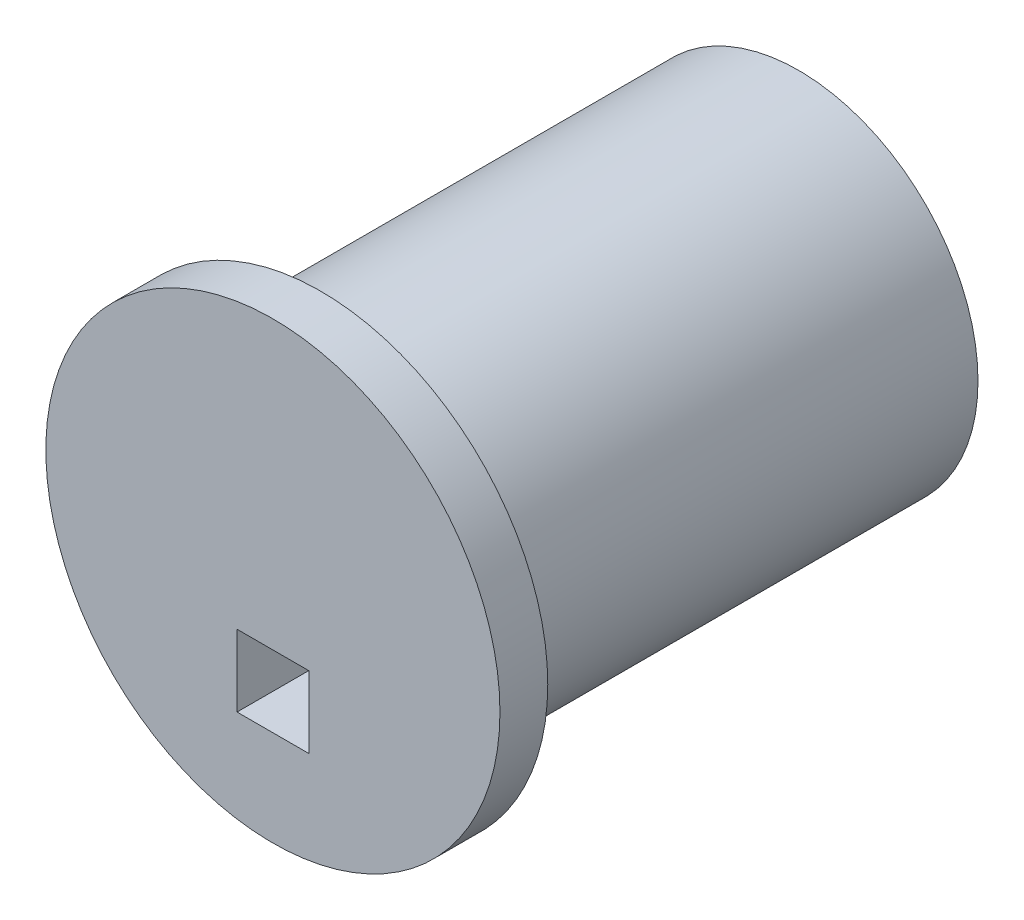
ISO-10303-21;
HEADER;
FILE_DESCRIPTION(('STEP AP214'),'2;1');
FILE_NAME('part.step','',(''),(''),'','','');
FILE_SCHEMA(('AUTOMOTIVE_DESIGN { 1 0 10303 214 1 1 1 1 }'));
ENDSEC;
DATA;
#1=APPLICATION_CONTEXT('core data for automotive mechanical design processes');
#2=APPLICATION_PROTOCOL_DEFINITION('international standard','automotive_design',2000,#1);
#3=PRODUCT_CONTEXT('',#1,'mechanical');
#4=PRODUCT('Part','Part','',(#3));
#5=PRODUCT_RELATED_PRODUCT_CATEGORY('part','',(#4));
#6=PRODUCT_DEFINITION_FORMATION('','',#4);
#7=PRODUCT_DEFINITION_CONTEXT('part definition',#1,'design');
#8=PRODUCT_DEFINITION('design','',#6,#7);
#9=PRODUCT_DEFINITION_SHAPE('','',#8);
#10=(LENGTH_UNIT() NAMED_UNIT(*) SI_UNIT(.MILLI.,.METRE.));
#11=(NAMED_UNIT(*) PLANE_ANGLE_UNIT() SI_UNIT($,.RADIAN.));
#12=(NAMED_UNIT(*) SI_UNIT($,.STERADIAN.) SOLID_ANGLE_UNIT());
#13=UNCERTAINTY_MEASURE_WITH_UNIT(LENGTH_MEASURE(1.E-05),#10,'distance_accuracy_value','');
#14=(GEOMETRIC_REPRESENTATION_CONTEXT(3) GLOBAL_UNCERTAINTY_ASSIGNED_CONTEXT((#13)) GLOBAL_UNIT_ASSIGNED_CONTEXT((#10,
#11,#12)) REPRESENTATION_CONTEXT('',''));
#15=CARTESIAN_POINT('',(0.,0.,0.));
#16=DIRECTION('',(0.,0.,1.));
#17=DIRECTION('',(1.,0.,0.));
#18=AXIS2_PLACEMENT_3D('',#15,#16,#17);
#19=CARTESIAN_POINT('',(0.,0.,22.));
#20=DIRECTION('',(0.,0.,-1.));
#21=DIRECTION('',(-1.,0.,0.));
#22=AXIS2_PLACEMENT_3D('',#19,#20,#21);
#23=CYLINDRICAL_SURFACE('',#22,7.5);
#24=CARTESIAN_POINT('',(0.,0.,0.));
#25=DIRECTION('',(0.,0.,1.));
#26=DIRECTION('',(1.,0.,0.));
#27=AXIS2_PLACEMENT_3D('',#24,#25,#26);
#28=CIRCLE('',#27,7.5);
#29=CARTESIAN_POINT('',(7.5,0.,0.));
#30=VERTEX_POINT('',#29);
#31=EDGE_CURVE('E40',#30,#30,#28,.T.);
#32=ORIENTED_EDGE('',*,*,#31,.T.);
#33=EDGE_LOOP('',(#32));
#34=FACE_BOUND('',#33,.T.);
#35=CARTESIAN_POINT('',(0.,0.,20.));
#36=DIRECTION('',(0.,0.,1.));
#37=DIRECTION('',(1.,0.,0.));
#38=AXIS2_PLACEMENT_3D('',#35,#36,#37);
#39=CIRCLE('',#38,7.5);
#40=CARTESIAN_POINT('',(7.5,0.,20.));
#41=VERTEX_POINT('',#40);
#42=EDGE_CURVE('E11',#41,#41,#39,.T.);
#43=ORIENTED_EDGE('',*,*,#42,.F.);
#44=EDGE_LOOP('',(#43));
#45=FACE_BOUND('',#44,.T.);
#46=ADVANCED_FACE('F33',(#34,#45),#23,.T.);
#47=CARTESIAN_POINT('',(0.,0.,0.));
#48=DIRECTION('',(0.,0.,1.));
#49=DIRECTION('',(1.,0.,0.));
#50=AXIS2_PLACEMENT_3D('',#47,#48,#49);
#51=PLANE('',#50);
#52=CARTESIAN_POINT('',(-4.,0.,0.));
#53=DIRECTION('',(0.,0.,-1.));
#54=DIRECTION('',(0.,-1.,0.));
#55=AXIS2_PLACEMENT_3D('',#52,#53,#54);
#56=CIRCLE('',#55,1.5);
#57=CARTESIAN_POINT('',(-3.99999999999999,-1.50000000000001,0.));
#58=VERTEX_POINT('',#57);
#59=EDGE_CURVE('E200',#58,#58,#56,.T.);
#60=ORIENTED_EDGE('',*,*,#59,.F.);
#61=EDGE_LOOP('',(#60));
#62=FACE_BOUND('',#61,.T.);
#63=CARTESIAN_POINT('',(0.,-4.,0.));
#64=DIRECTION('',(0.,0.,-1.));
#65=DIRECTION('',(1.,0.,0.));
#66=AXIS2_PLACEMENT_3D('',#63,#64,#65);
#67=CIRCLE('',#66,1.5);
#68=CARTESIAN_POINT('',(1.5,-4.,0.));
#69=VERTEX_POINT('',#68);
#70=EDGE_CURVE('E206',#69,#69,#67,.T.);
#71=ORIENTED_EDGE('',*,*,#70,.F.);
#72=EDGE_LOOP('',(#71));
#73=FACE_BOUND('',#72,.T.);
#74=CARTESIAN_POINT('',(4.,0.,0.));
#75=DIRECTION('',(0.,0.,-1.));
#76=DIRECTION('',(0.,1.,0.));
#77=AXIS2_PLACEMENT_3D('',#74,#75,#76);
#78=CIRCLE('',#77,1.5);
#79=CARTESIAN_POINT('',(3.99999999999998,1.50000000000004,0.));
#80=VERTEX_POINT('',#79);
#81=EDGE_CURVE('E187',#80,#80,#78,.T.);
#82=ORIENTED_EDGE('',*,*,#81,.F.);
#83=EDGE_LOOP('',(#82));
#84=FACE_BOUND('',#83,.T.);
#85=CARTESIAN_POINT('',(0.,4.,0.));
#86=DIRECTION('',(0.,0.,-1.));
#87=DIRECTION('',(-1.,0.,0.));
#88=AXIS2_PLACEMENT_3D('',#85,#86,#87);
#89=CIRCLE('',#88,1.5);
#90=CARTESIAN_POINT('',(-1.5,4.,0.));
#91=VERTEX_POINT('',#90);
#92=EDGE_CURVE('E199',#91,#91,#89,.T.);
#93=ORIENTED_EDGE('',*,*,#92,.F.);
#94=EDGE_LOOP('',(#93));
#95=FACE_BOUND('',#94,.T.);
#96=ORIENTED_EDGE('',*,*,#31,.F.);
#97=EDGE_LOOP('',(#96));
#98=FACE_BOUND('',#97,.T.);
#99=ADVANCED_FACE('F116',(#62,#73,#84,#95,#98),#51,.F.);
#100=CARTESIAN_POINT('',(0.,4.,5.));
#101=DIRECTION('',(0.,0.,-1.));
#102=DIRECTION('',(-1.,0.,0.));
#103=AXIS2_PLACEMENT_3D('',#100,#101,#102);
#104=CYLINDRICAL_SURFACE('',#103,1.5);
#105=CARTESIAN_POINT('',(0.,4.,5.));
#106=DIRECTION('',(0.,0.,-1.));
#107=DIRECTION('',(-1.,0.,0.));
#108=AXIS2_PLACEMENT_3D('',#105,#106,#107);
#109=CIRCLE('',#108,1.5);
#110=CARTESIAN_POINT('',(-1.5,4.,5.));
#111=VERTEX_POINT('',#110);
#112=EDGE_CURVE('E104',#111,#111,#109,.T.);
#113=ORIENTED_EDGE('',*,*,#112,.F.);
#114=EDGE_LOOP('',(#113));
#115=FACE_BOUND('',#114,.T.);
#116=ORIENTED_EDGE('',*,*,#92,.T.);
#117=EDGE_LOOP('',(#116));
#118=FACE_BOUND('',#117,.T.);
#119=ADVANCED_FACE('F118',(#115,#118),#104,.F.);
#120=CARTESIAN_POINT('',(0.,4.,5.));
#121=DIRECTION('',(0.,0.,-1.));
#122=DIRECTION('',(-1.,0.,0.));
#123=AXIS2_PLACEMENT_3D('',#120,#121,#122);
#124=PLANE('',#123);
#125=ORIENTED_EDGE('',*,*,#112,.T.);
#126=EDGE_LOOP('',(#125));
#127=FACE_BOUND('',#126,.T.);
#128=ADVANCED_FACE('F124',(#127),#124,.T.);
#129=CARTESIAN_POINT('',(4.,0.,5.));
#130=DIRECTION('',(0.,0.,-1.));
#131=DIRECTION('',(-1.,0.,0.));
#132=AXIS2_PLACEMENT_3D('',#129,#130,#131);
#133=CYLINDRICAL_SURFACE('',#132,1.5);
#134=CARTESIAN_POINT('',(4.,0.,5.));
#135=DIRECTION('',(0.,0.,-1.));
#136=DIRECTION('',(0.,1.,0.));
#137=AXIS2_PLACEMENT_3D('',#134,#135,#136);
#138=CIRCLE('',#137,1.5);
#139=CARTESIAN_POINT('',(3.99999999999998,1.50000000000004,5.));
#140=VERTEX_POINT('',#139);
#141=EDGE_CURVE('E191',#140,#140,#138,.T.);
#142=ORIENTED_EDGE('',*,*,#141,.F.);
#143=EDGE_LOOP('',(#142));
#144=FACE_BOUND('',#143,.T.);
#145=ORIENTED_EDGE('',*,*,#81,.T.);
#146=EDGE_LOOP('',(#145));
#147=FACE_BOUND('',#146,.T.);
#148=ADVANCED_FACE('F149',(#144,#147),#133,.F.);
#149=CARTESIAN_POINT('',(4.,0.,5.));
#150=DIRECTION('',(0.,0.,-1.));
#151=DIRECTION('',(0.,1.,0.));
#152=AXIS2_PLACEMENT_3D('',#149,#150,#151);
#153=PLANE('',#152);
#154=ORIENTED_EDGE('',*,*,#141,.T.);
#155=EDGE_LOOP('',(#154));
#156=FACE_BOUND('',#155,.T.);
#157=ADVANCED_FACE('F153',(#156),#153,.T.);
#158=CARTESIAN_POINT('',(0.,-4.,5.));
#159=DIRECTION('',(0.,0.,-1.));
#160=DIRECTION('',(-1.,0.,0.));
#161=AXIS2_PLACEMENT_3D('',#158,#159,#160);
#162=CYLINDRICAL_SURFACE('',#161,1.5);
#163=CARTESIAN_POINT('',(0.,-4.,5.));
#164=DIRECTION('',(0.,0.,-1.));
#165=DIRECTION('',(1.,0.,0.));
#166=AXIS2_PLACEMENT_3D('',#163,#164,#165);
#167=CIRCLE('',#166,1.5);
#168=CARTESIAN_POINT('',(1.5,-4.,5.));
#169=VERTEX_POINT('',#168);
#170=EDGE_CURVE('E203',#169,#169,#167,.T.);
#171=ORIENTED_EDGE('',*,*,#170,.F.);
#172=EDGE_LOOP('',(#171));
#173=FACE_BOUND('',#172,.T.);
#174=ORIENTED_EDGE('',*,*,#70,.T.);
#175=EDGE_LOOP('',(#174));
#176=FACE_BOUND('',#175,.T.);
#177=ADVANCED_FACE('F157',(#173,#176),#162,.F.);
#178=CARTESIAN_POINT('',(0.,-4.,5.));
#179=DIRECTION('',(0.,0.,-1.));
#180=DIRECTION('',(1.,0.,0.));
#181=AXIS2_PLACEMENT_3D('',#178,#179,#180);
#182=PLANE('',#181);
#183=ORIENTED_EDGE('',*,*,#170,.T.);
#184=EDGE_LOOP('',(#183));
#185=FACE_BOUND('',#184,.T.);
#186=ADVANCED_FACE('F161',(#185),#182,.T.);
#187=CARTESIAN_POINT('',(-4.,0.,5.));
#188=DIRECTION('',(0.,0.,-1.));
#189=DIRECTION('',(-1.,0.,0.));
#190=AXIS2_PLACEMENT_3D('',#187,#188,#189);
#191=CYLINDRICAL_SURFACE('',#190,1.5);
#192=CARTESIAN_POINT('',(-4.,0.,5.));
#193=DIRECTION('',(0.,0.,-1.));
#194=DIRECTION('',(0.,-1.,0.));
#195=AXIS2_PLACEMENT_3D('',#192,#193,#194);
#196=CIRCLE('',#195,1.5);
#197=CARTESIAN_POINT('',(-3.99999999999999,-1.50000000000001,5.));
#198=VERTEX_POINT('',#197);
#199=EDGE_CURVE('E196',#198,#198,#196,.T.);
#200=ORIENTED_EDGE('',*,*,#199,.F.);
#201=EDGE_LOOP('',(#200));
#202=FACE_BOUND('',#201,.T.);
#203=ORIENTED_EDGE('',*,*,#59,.T.);
#204=EDGE_LOOP('',(#203));
#205=FACE_BOUND('',#204,.T.);
#206=ADVANCED_FACE('F165',(#202,#205),#191,.F.);
#207=CARTESIAN_POINT('',(-4.,0.,5.));
#208=DIRECTION('',(0.,0.,-1.));
#209=DIRECTION('',(0.,-1.,0.));
#210=AXIS2_PLACEMENT_3D('',#207,#208,#209);
#211=PLANE('',#210);
#212=ORIENTED_EDGE('',*,*,#199,.T.);
#213=EDGE_LOOP('',(#212));
#214=FACE_BOUND('',#213,.T.);
#215=ADVANCED_FACE('F169',(#214),#211,.T.);
#216=CARTESIAN_POINT('',(0.,0.,20.));
#217=DIRECTION('',(0.,0.,1.));
#218=DIRECTION('',(1.,0.,0.));
#219=AXIS2_PLACEMENT_3D('',#216,#217,#218);
#220=CYLINDRICAL_SURFACE('',#219,9.5);
#221=CARTESIAN_POINT('',(0.,0.,20.));
#222=DIRECTION('',(0.,0.,1.));
#223=DIRECTION('',(1.,0.,0.));
#224=AXIS2_PLACEMENT_3D('',#221,#222,#223);
#225=CIRCLE('',#224,9.5);
#226=CARTESIAN_POINT('',(9.5,0.,20.));
#227=VERTEX_POINT('',#226);
#228=EDGE_CURVE('E186',#227,#227,#225,.T.);
#229=ORIENTED_EDGE('',*,*,#228,.T.);
#230=EDGE_LOOP('',(#229));
#231=FACE_BOUND('',#230,.T.);
#232=CARTESIAN_POINT('',(0.,0.,22.));
#233=DIRECTION('',(0.,0.,1.));
#234=DIRECTION('',(1.,0.,0.));
#235=AXIS2_PLACEMENT_3D('',#232,#233,#234);
#236=CIRCLE('',#235,9.5);
#237=CARTESIAN_POINT('',(9.5,0.,22.));
#238=VERTEX_POINT('',#237);
#239=EDGE_CURVE('E188',#238,#238,#236,.T.);
#240=ORIENTED_EDGE('',*,*,#239,.F.);
#241=EDGE_LOOP('',(#240));
#242=FACE_BOUND('',#241,.T.);
#243=ADVANCED_FACE('F173',(#231,#242),#220,.T.);
#244=CARTESIAN_POINT('',(0.,0.,20.));
#245=DIRECTION('',(0.,0.,1.));
#246=DIRECTION('',(1.,0.,0.));
#247=AXIS2_PLACEMENT_3D('',#244,#245,#246);
#248=PLANE('',#247);
#249=ORIENTED_EDGE('',*,*,#42,.T.);
#250=EDGE_LOOP('',(#249));
#251=FACE_BOUND('',#250,.T.);
#252=ORIENTED_EDGE('',*,*,#228,.F.);
#253=EDGE_LOOP('',(#252));
#254=FACE_BOUND('',#253,.T.);
#255=ADVANCED_FACE('F145',(#251,#254),#248,.F.);
#256=CARTESIAN_POINT('',(0.,0.,12.));
#257=DIRECTION('',(0.,0.,-1.));
#258=DIRECTION('',(-1.,0.,0.));
#259=AXIS2_PLACEMENT_3D('',#256,#257,#258);
#260=PLANE('',#259);
#261=DIRECTION('',(0.,1.,0.));
#262=VECTOR('',#261,1.);
#263=CARTESIAN_POINT('',(1.5,-5.5,12.));
#264=LINE('',#263,#262);
#265=CARTESIAN_POINT('',(1.5,-5.5,12.));
#266=VERTEX_POINT('',#265);
#267=CARTESIAN_POINT('',(1.5,-2.5,12.));
#268=VERTEX_POINT('',#267);
#269=EDGE_CURVE('E96',#266,#268,#264,.T.);
#270=ORIENTED_EDGE('',*,*,#269,.T.);
#271=DIRECTION('',(-1.,0.,0.));
#272=VECTOR('',#271,1.);
#273=CARTESIAN_POINT('',(-1.5,-2.5,12.));
#274=LINE('',#273,#272);
#275=CARTESIAN_POINT('',(-1.5,-2.5,12.));
#276=VERTEX_POINT('',#275);
#277=EDGE_CURVE('E79',#268,#276,#274,.T.);
#278=ORIENTED_EDGE('',*,*,#277,.T.);
#279=DIRECTION('',(0.,-1.,0.));
#280=VECTOR('',#279,1.);
#281=CARTESIAN_POINT('',(-1.5,-5.5,12.));
#282=LINE('',#281,#280);
#283=CARTESIAN_POINT('',(-1.5,-5.5,12.));
#284=VERTEX_POINT('',#283);
#285=EDGE_CURVE('E89',#276,#284,#282,.T.);
#286=ORIENTED_EDGE('',*,*,#285,.T.);
#287=DIRECTION('',(1.,0.,0.));
#288=VECTOR('',#287,1.);
#289=CARTESIAN_POINT('',(-1.5,-5.5,12.));
#290=LINE('',#289,#288);
#291=EDGE_CURVE('E93',#284,#266,#290,.T.);
#292=ORIENTED_EDGE('',*,*,#291,.T.);
#293=EDGE_LOOP('',(#270,#278,#286,#292));
#294=FACE_BOUND('',#293,.T.);
#295=ADVANCED_FACE('F95',(#294),#260,.F.);
#296=CARTESIAN_POINT('',(-1.5,-2.5,12.));
#297=DIRECTION('',(0.,1.,0.));
#298=DIRECTION('',(0.,0.,1.));
#299=AXIS2_PLACEMENT_3D('',#296,#297,#298);
#300=PLANE('',#299);
#301=DIRECTION('',(-1.,0.,0.));
#302=VECTOR('',#301,1.);
#303=CARTESIAN_POINT('',(-1.5,-2.5,22.));
#304=LINE('',#303,#302);
#305=CARTESIAN_POINT('',(1.5,-2.5,22.));
#306=VERTEX_POINT('',#305);
#307=CARTESIAN_POINT('',(-1.5,-2.5,22.));
#308=VERTEX_POINT('',#307);
#309=EDGE_CURVE('E82',#306,#308,#304,.T.);
#310=ORIENTED_EDGE('',*,*,#309,.T.);
#311=DIRECTION('',(0.,0.,1.));
#312=VECTOR('',#311,1.);
#313=CARTESIAN_POINT('',(-1.5,-2.5,12.));
#314=LINE('',#313,#312);
#315=EDGE_CURVE('E75',#276,#308,#314,.T.);
#316=ORIENTED_EDGE('',*,*,#315,.F.);
#317=ORIENTED_EDGE('',*,*,#277,.F.);
#318=DIRECTION('',(0.,0.,1.));
#319=VECTOR('',#318,1.);
#320=CARTESIAN_POINT('',(1.5,-2.5,12.));
#321=LINE('',#320,#319);
#322=EDGE_CURVE('E70',#268,#306,#321,.T.);
#323=ORIENTED_EDGE('',*,*,#322,.T.);
#324=EDGE_LOOP('',(#310,#316,#317,#323));
#325=FACE_BOUND('',#324,.T.);
#326=ADVANCED_FACE('F77',(#325),#300,.F.);
#327=CARTESIAN_POINT('',(-1.5,-5.5,12.));
#328=DIRECTION('',(-1.,0.,0.));
#329=DIRECTION('',(0.,-1.,0.));
#330=AXIS2_PLACEMENT_3D('',#327,#328,#329);
#331=PLANE('',#330);
#332=DIRECTION('',(0.,-1.,0.));
#333=VECTOR('',#332,1.);
#334=CARTESIAN_POINT('',(-1.5,-5.5,22.));
#335=LINE('',#334,#333);
#336=CARTESIAN_POINT('',(-1.5,-5.5,22.));
#337=VERTEX_POINT('',#336);
#338=EDGE_CURVE('E106',#308,#337,#335,.T.);
#339=ORIENTED_EDGE('',*,*,#338,.T.);
#340=DIRECTION('',(0.,0.,1.));
#341=VECTOR('',#340,1.);
#342=CARTESIAN_POINT('',(-1.5,-5.5,12.));
#343=LINE('',#342,#341);
#344=EDGE_CURVE('E86',#284,#337,#343,.T.);
#345=ORIENTED_EDGE('',*,*,#344,.F.);
#346=ORIENTED_EDGE('',*,*,#285,.F.);
#347=ORIENTED_EDGE('',*,*,#315,.T.);
#348=EDGE_LOOP('',(#339,#345,#346,#347));
#349=FACE_BOUND('',#348,.T.);
#350=ADVANCED_FACE('F90',(#349),#331,.F.);
#351=CARTESIAN_POINT('',(-1.5,-5.5,12.));
#352=DIRECTION('',(0.,-1.,0.));
#353=DIRECTION('',(0.,0.,-1.));
#354=AXIS2_PLACEMENT_3D('',#351,#352,#353);
#355=PLANE('',#354);
#356=DIRECTION('',(1.,0.,0.));
#357=VECTOR('',#356,1.);
#358=CARTESIAN_POINT('',(-1.5,-5.5,22.));
#359=LINE('',#358,#357);
#360=CARTESIAN_POINT('',(1.5,-5.5,22.));
#361=VERTEX_POINT('',#360);
#362=EDGE_CURVE('E98',#337,#361,#359,.T.);
#363=ORIENTED_EDGE('',*,*,#362,.T.);
#364=DIRECTION('',(0.,0.,1.));
#365=VECTOR('',#364,1.);
#366=CARTESIAN_POINT('',(1.5,-5.5,12.));
#367=LINE('',#366,#365);
#368=EDGE_CURVE('E55',#266,#361,#367,.T.);
#369=ORIENTED_EDGE('',*,*,#368,.F.);
#370=ORIENTED_EDGE('',*,*,#291,.F.);
#371=ORIENTED_EDGE('',*,*,#344,.T.);
#372=EDGE_LOOP('',(#363,#369,#370,#371));
#373=FACE_BOUND('',#372,.T.);
#374=ADVANCED_FACE('F137',(#373),#355,.F.);
#375=CARTESIAN_POINT('',(1.5,-5.5,12.));
#376=DIRECTION('',(1.,0.,0.));
#377=DIRECTION('',(0.,1.,0.));
#378=AXIS2_PLACEMENT_3D('',#375,#376,#377);
#379=PLANE('',#378);
#380=DIRECTION('',(0.,1.,0.));
#381=VECTOR('',#380,1.);
#382=CARTESIAN_POINT('',(1.5,-5.5,22.));
#383=LINE('',#382,#381);
#384=EDGE_CURVE('E47',#361,#306,#383,.T.);
#385=ORIENTED_EDGE('',*,*,#384,.T.);
#386=ORIENTED_EDGE('',*,*,#322,.F.);
#387=ORIENTED_EDGE('',*,*,#269,.F.);
#388=ORIENTED_EDGE('',*,*,#368,.T.);
#389=EDGE_LOOP('',(#385,#386,#387,#388));
#390=FACE_BOUND('',#389,.T.);
#391=ADVANCED_FACE('F133',(#390),#379,.F.);
#392=CARTESIAN_POINT('',(0.,0.,22.));
#393=DIRECTION('',(0.,0.,1.));
#394=DIRECTION('',(1.,0.,0.));
#395=AXIS2_PLACEMENT_3D('',#392,#393,#394);
#396=PLANE('',#395);
#397=ORIENTED_EDGE('',*,*,#384,.F.);
#398=ORIENTED_EDGE('',*,*,#362,.F.);
#399=ORIENTED_EDGE('',*,*,#338,.F.);
#400=ORIENTED_EDGE('',*,*,#309,.F.);
#401=EDGE_LOOP('',(#397,#398,#399,#400));
#402=FACE_BOUND('',#401,.T.);
#403=ORIENTED_EDGE('',*,*,#239,.T.);
#404=EDGE_LOOP('',(#403));
#405=FACE_BOUND('',#404,.T.);
#406=ADVANCED_FACE('F130',(#402,#405),#396,.T.);
#407=CLOSED_SHELL('',(#46,#99,#119,#128,#148,#157,#177,#186,#206,#215,#243,#255,#295,#326,#350,
#374,#391,#406));
#408=MANIFOLD_SOLID_BREP('B2',#407);
#409=ADVANCED_BREP_SHAPE_REPRESENTATION('',(#18,#408),#14);
#410=SHAPE_DEFINITION_REPRESENTATION(#9,#409);
ENDSEC;
END-ISO-10303-21;
